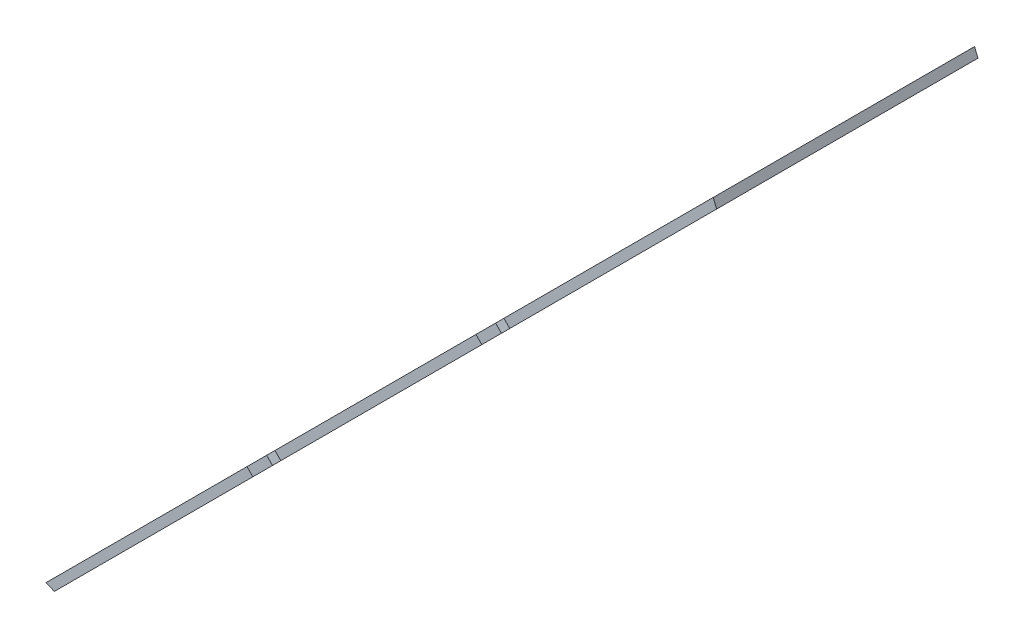
ISO-10303-21;
HEADER;
FILE_DESCRIPTION(('STEP AP214'),'2;1');
FILE_NAME('part.step','',(''),(''),'','','');
FILE_SCHEMA(('AUTOMOTIVE_DESIGN { 1 0 10303 214 1 1 1 1 }'));
ENDSEC;
DATA;
#1=APPLICATION_CONTEXT('core data for automotive mechanical design processes');
#2=APPLICATION_PROTOCOL_DEFINITION('international standard','automotive_design',2000,#1);
#3=PRODUCT_CONTEXT('',#1,'mechanical');
#4=PRODUCT('Part','Part','',(#3));
#5=PRODUCT_RELATED_PRODUCT_CATEGORY('part','',(#4));
#6=PRODUCT_DEFINITION_FORMATION('','',#4);
#7=PRODUCT_DEFINITION_CONTEXT('part definition',#1,'design');
#8=PRODUCT_DEFINITION('design','',#6,#7);
#9=PRODUCT_DEFINITION_SHAPE('','',#8);
#10=(LENGTH_UNIT() NAMED_UNIT(*) SI_UNIT(.MILLI.,.METRE.));
#11=(NAMED_UNIT(*) PLANE_ANGLE_UNIT() SI_UNIT($,.RADIAN.));
#12=(NAMED_UNIT(*) SI_UNIT($,.STERADIAN.) SOLID_ANGLE_UNIT());
#13=UNCERTAINTY_MEASURE_WITH_UNIT(LENGTH_MEASURE(1.E-05),#10,'distance_accuracy_value','');
#14=(GEOMETRIC_REPRESENTATION_CONTEXT(3) GLOBAL_UNCERTAINTY_ASSIGNED_CONTEXT((#13)) GLOBAL_UNIT_ASSIGNED_CONTEXT((#10,
#11,#12)) REPRESENTATION_CONTEXT('',''));
#15=CARTESIAN_POINT('',(0.,0.,0.));
#16=DIRECTION('',(0.,0.,1.));
#17=DIRECTION('',(1.,0.,0.));
#18=AXIS2_PLACEMENT_3D('',#15,#16,#17);
#19=CARTESIAN_POINT('',(265.75,498.5,48.5));
#20=DIRECTION('',(0.,0.,-1.));
#21=DIRECTION('',(-1.,0.,0.));
#22=AXIS2_PLACEMENT_3D('',#19,#20,#21);
#23=PLANE('',#22);
#24=DIRECTION('',(0.707106781186549,0.707106781186546,0.));
#25=VECTOR('',#24,1.);
#26=CARTESIAN_POINT('',(-584.25,380.000000000001,48.5));
#27=LINE('',#26,#25);
#28=CARTESIAN_POINT('',(-543.071488698023,421.178511301978,48.5));
#29=VERTEX_POINT('',#28);
#30=CARTESIAN_POINT('',(-505.428511301978,458.821488698023,48.5));
#31=VERTEX_POINT('',#30);
#32=EDGE_CURVE('E67',#29,#31,#27,.T.);
#33=ORIENTED_EDGE('',*,*,#32,.F.);
#34=DIRECTION('',(-0.707106781186546,0.707106781186549,0.));
#35=VECTOR('',#34,1.);
#36=CARTESIAN_POINT('',(-542.010828526243,420.117851130198,48.5));
#37=LINE('',#36,#35);
#38=CARTESIAN_POINT('',(-542.010828526243,420.117851130198,48.5));
#39=VERTEX_POINT('',#38);
#40=EDGE_CURVE('E187',#39,#29,#37,.T.);
#41=ORIENTED_EDGE('',*,*,#40,.F.);
#42=DIRECTION('',(-0.707106781186549,-0.707106781186546,0.));
#43=VECTOR('',#42,1.);
#44=CARTESIAN_POINT('',(-463.628679656441,498.5,48.5));
#45=LINE('',#44,#43);
#46=CARTESIAN_POINT('',(-504.367851130198,457.760828526243,48.5));
#47=VERTEX_POINT('',#46);
#48=EDGE_CURVE('E45',#47,#39,#45,.T.);
#49=ORIENTED_EDGE('',*,*,#48,.F.);
#50=DIRECTION('',(-0.707106781186546,0.707106781186549,0.));
#51=VECTOR('',#50,1.);
#52=CARTESIAN_POINT('',(-504.367851130198,457.760828526243,48.5));
#53=LINE('',#52,#51);
#54=EDGE_CURVE('E399',#47,#31,#53,.T.);
#55=ORIENTED_EDGE('',*,*,#54,.T.);
#56=EDGE_LOOP('',(#33,#41,#49,#55));
#57=FACE_BOUND('',#56,.T.);
#58=ADVANCED_FACE('F41',(#57),#23,.F.);
#59=DIRECTION('',(-0.707106781186546,0.707106781186549,0.));
#60=VECTOR('',#59,1.);
#61=CARTESIAN_POINT('',(-500.832317224266,461.296362432176,48.5));
#62=LINE('',#61,#60);
#63=CARTESIAN_POINT('',(-500.832317224266,461.296362432176,48.5));
#64=VERTEX_POINT('',#63);
#65=CARTESIAN_POINT('',(-501.892977396045,462.357022603955,48.5));
#66=VERTEX_POINT('',#65);
#67=EDGE_CURVE('E389',#64,#66,#62,.T.);
#68=ORIENTED_EDGE('',*,*,#67,.F.);
#69=CARTESIAN_POINT('',(-463.628679656441,498.5,48.5));
#70=VERTEX_POINT('',#69);
#71=EDGE_CURVE('E51',#70,#64,#45,.T.);
#72=ORIENTED_EDGE('',*,*,#71,.F.);
#73=DIRECTION('',(-0.382683432364995,0.923879532511326,0.));
#74=VECTOR('',#73,1.);
#75=CARTESIAN_POINT('',(-356.813645047253,240.625694781073,48.5));
#76=LINE('',#75,#74);
#77=CARTESIAN_POINT('',(-464.25,500.,48.5));
#78=VERTEX_POINT('',#77);
#79=EDGE_CURVE('E229',#70,#78,#76,.T.);
#80=ORIENTED_EDGE('',*,*,#79,.T.);
#81=EDGE_CURVE('E239',#66,#78,#27,.T.);
#82=ORIENTED_EDGE('',*,*,#81,.F.);
#83=EDGE_LOOP('',(#68,#72,#80,#82));
#84=FACE_BOUND('',#83,.T.);
#85=ADVANCED_FACE('F358',(#84),#23,.F.);
#86=CARTESIAN_POINT('',(265.75,440.,1.5));
#87=DIRECTION('',(0.,0.,1.));
#88=DIRECTION('',(1.,0.,0.));
#89=AXIS2_PLACEMENT_3D('',#86,#87,#88);
#90=PLANE('',#89);
#91=DIRECTION('',(-0.707106781186549,-0.707106781186546,0.));
#92=VECTOR('',#91,1.);
#93=CARTESIAN_POINT('',(-584.25,380.000000000001,1.5));
#94=LINE('',#93,#92);
#95=CARTESIAN_POINT('',(-505.428511301978,458.821488698023,1.5));
#96=VERTEX_POINT('',#95);
#97=CARTESIAN_POINT('',(-543.071488698023,421.178511301978,1.5));
#98=VERTEX_POINT('',#97);
#99=EDGE_CURVE('E254',#96,#98,#94,.T.);
#100=ORIENTED_EDGE('',*,*,#99,.F.);
#101=DIRECTION('',(-0.707106781186546,0.707106781186549,0.));
#102=VECTOR('',#101,1.);
#103=CARTESIAN_POINT('',(-504.367851130198,457.760828526243,1.5));
#104=LINE('',#103,#102);
#105=CARTESIAN_POINT('',(-504.367851130198,457.760828526243,1.5));
#106=VERTEX_POINT('',#105);
#107=EDGE_CURVE('E325',#106,#96,#104,.T.);
#108=ORIENTED_EDGE('',*,*,#107,.F.);
#109=DIRECTION('',(0.707106781186549,0.707106781186546,0.));
#110=VECTOR('',#109,1.);
#111=CARTESIAN_POINT('',(-583.189339828221,378.939339828221,1.49999999999996));
#112=LINE('',#111,#110);
#113=CARTESIAN_POINT('',(-542.010828526243,420.117851130198,1.5));
#114=VERTEX_POINT('',#113);
#115=EDGE_CURVE('E225',#114,#106,#112,.T.);
#116=ORIENTED_EDGE('',*,*,#115,.F.);
#117=DIRECTION('',(-0.707106781186546,0.707106781186549,0.));
#118=VECTOR('',#117,1.);
#119=CARTESIAN_POINT('',(-542.010828526243,420.117851130198,1.5));
#120=LINE('',#119,#118);
#121=EDGE_CURVE('E287',#114,#98,#120,.T.);
#122=ORIENTED_EDGE('',*,*,#121,.T.);
#123=EDGE_LOOP('',(#100,#108,#116,#122));
#124=FACE_BOUND('',#123,.T.);
#125=ADVANCED_FACE('F305',(#124),#90,.F.);
#126=DIRECTION('',(-0.707106781186546,0.707106781186549,0.));
#127=VECTOR('',#126,1.);
#128=CARTESIAN_POINT('',(-545.546362432176,416.582317224266,1.5));
#129=LINE('',#128,#127);
#130=CARTESIAN_POINT('',(-545.546362432176,416.582317224266,1.5));
#131=VERTEX_POINT('',#130);
#132=CARTESIAN_POINT('',(-546.607022603956,417.642977396045,1.5));
#133=VERTEX_POINT('',#132);
#134=EDGE_CURVE('E269',#131,#133,#129,.T.);
#135=ORIENTED_EDGE('',*,*,#134,.F.);
#136=CARTESIAN_POINT('',(-582.75,379.378679656441,1.49999999999997));
#137=VERTEX_POINT('',#136);
#138=EDGE_CURVE('E211',#137,#131,#112,.T.);
#139=ORIENTED_EDGE('',*,*,#138,.F.);
#140=DIRECTION('',(0.923879532511316,-0.382683432365019,0.));
#141=VECTOR('',#140,1.);
#142=CARTESIAN_POINT('',(120.057178568736,88.2664145601641,1.5));
#143=LINE('',#142,#141);
#144=CARTESIAN_POINT('',(-584.25,380.000000000001,1.5));
#145=VERTEX_POINT('',#144);
#146=EDGE_CURVE('E233',#145,#137,#143,.T.);
#147=ORIENTED_EDGE('',*,*,#146,.F.);
#148=EDGE_CURVE('E251',#133,#145,#94,.T.);
#149=ORIENTED_EDGE('',*,*,#148,.F.);
#150=EDGE_LOOP('',(#135,#139,#147,#149));
#151=FACE_BOUND('',#150,.T.);
#152=ADVANCED_FACE('F268',(#151),#90,.F.);
#153=CARTESIAN_POINT('',(-463.628679656441,498.5,50.0101030776414));
#154=DIRECTION('',(-0.923879532511326,-0.382683432364995,0.));
#155=DIRECTION('',(0.382683432364995,-0.923879532511326,0.));
#156=AXIS2_PLACEMENT_3D('',#153,#154,#155);
#157=PLANE('',#156);
#158=DIRECTION('',(0.,0.,1.));
#159=VECTOR('',#158,1.);
#160=CARTESIAN_POINT('',(-464.25,500.,50.));
#161=LINE('',#160,#159);
#162=CARTESIAN_POINT('',(-464.25,500.,1.5));
#163=VERTEX_POINT('',#162);
#164=EDGE_CURVE('E226',#163,#78,#161,.T.);
#165=ORIENTED_EDGE('',*,*,#164,.T.);
#166=ORIENTED_EDGE('',*,*,#79,.F.);
#167=DIRECTION('',(0.,0.,1.));
#168=VECTOR('',#167,1.);
#169=CARTESIAN_POINT('',(-463.628679656441,498.5,50.));
#170=LINE('',#169,#168);
#171=CARTESIAN_POINT('',(-463.628679656441,498.5,1.49999999999996));
#172=VERTEX_POINT('',#171);
#173=EDGE_CURVE('E208',#172,#70,#170,.T.);
#174=ORIENTED_EDGE('',*,*,#173,.F.);
#175=DIRECTION('',(0.382683432364995,-0.923879532511326,0.));
#176=VECTOR('',#175,1.);
#177=CARTESIAN_POINT('',(-336.130771697551,190.692821431363,1.5));
#178=LINE('',#177,#176);
#179=EDGE_CURVE('E235',#163,#172,#178,.T.);
#180=ORIENTED_EDGE('',*,*,#179,.F.);
#181=EDGE_LOOP('',(#165,#166,#174,#180));
#182=FACE_BOUND('',#181,.T.);
#183=ADVANCED_FACE('F368',(#182),#157,.F.);
#184=CARTESIAN_POINT('',(-545.546362432176,416.582317224266,48.5));
#185=VERTEX_POINT('',#184);
#186=CARTESIAN_POINT('',(-582.750000000001,379.378679656441,48.5));
#187=VERTEX_POINT('',#186);
#188=EDGE_CURVE('E205',#185,#187,#45,.T.);
#189=ORIENTED_EDGE('',*,*,#188,.F.);
#190=DIRECTION('',(-0.707106781186546,0.707106781186549,0.));
#191=VECTOR('',#190,1.);
#192=CARTESIAN_POINT('',(-545.546362432176,416.582317224266,48.5));
#193=LINE('',#192,#191);
#194=CARTESIAN_POINT('',(-546.607022603956,417.642977396045,48.5));
#195=VERTEX_POINT('',#194);
#196=EDGE_CURVE('E196',#185,#195,#193,.T.);
#197=ORIENTED_EDGE('',*,*,#196,.T.);
#198=CARTESIAN_POINT('',(-584.25,380.000000000001,48.5));
#199=VERTEX_POINT('',#198);
#200=EDGE_CURVE('E245',#199,#195,#27,.T.);
#201=ORIENTED_EDGE('',*,*,#200,.F.);
#202=DIRECTION('',(-0.923879532511316,0.382683432365019,0.));
#203=VECTOR('',#202,1.);
#204=CARTESIAN_POINT('',(99.3743052190322,96.8335412104544,48.5));
#205=LINE('',#204,#203);
#206=EDGE_CURVE('E11',#187,#199,#205,.T.);
#207=ORIENTED_EDGE('',*,*,#206,.F.);
#208=EDGE_LOOP('',(#189,#197,#201,#207));
#209=FACE_BOUND('',#208,.T.);
#210=ADVANCED_FACE('F360',(#209),#23,.F.);
#211=CARTESIAN_POINT('',(-582.75,379.378679656441,50.0101030776414));
#212=DIRECTION('',(-0.382683432365019,-0.923879532511316,0.));
#213=DIRECTION('',(0.923879532511316,-0.382683432365019,0.));
#214=AXIS2_PLACEMENT_3D('',#211,#212,#213);
#215=PLANE('',#214);
#216=DIRECTION('',(0.,0.,1.));
#217=VECTOR('',#216,1.);
#218=CARTESIAN_POINT('',(-584.25,380.000000000001,50.));
#219=LINE('',#218,#217);
#220=EDGE_CURVE('E215',#145,#199,#219,.T.);
#221=ORIENTED_EDGE('',*,*,#220,.F.);
#222=ORIENTED_EDGE('',*,*,#146,.T.);
#223=DIRECTION('',(0.,0.,1.));
#224=VECTOR('',#223,1.);
#225=CARTESIAN_POINT('',(-582.750000000001,379.378679656441,50.));
#226=LINE('',#225,#224);
#227=EDGE_CURVE('E220',#187,#137,#226,.F.);
#228=ORIENTED_EDGE('',*,*,#227,.F.);
#229=ORIENTED_EDGE('',*,*,#206,.T.);
#230=EDGE_LOOP('',(#221,#222,#228,#229));
#231=FACE_BOUND('',#230,.T.);
#232=ADVANCED_FACE('F263',(#231),#215,.T.);
#233=CARTESIAN_POINT('',(-500.832317224266,461.296362432176,1.49999999999996));
#234=VERTEX_POINT('',#233);
#235=EDGE_CURVE('E222',#234,#172,#112,.T.);
#236=ORIENTED_EDGE('',*,*,#235,.F.);
#237=DIRECTION('',(-0.707106781186546,0.707106781186549,0.));
#238=VECTOR('',#237,1.);
#239=CARTESIAN_POINT('',(-500.832317224266,461.296362432176,1.5));
#240=LINE('',#239,#238);
#241=CARTESIAN_POINT('',(-501.892977396045,462.357022603955,1.5));
#242=VERTEX_POINT('',#241);
#243=EDGE_CURVE('E327',#234,#242,#240,.T.);
#244=ORIENTED_EDGE('',*,*,#243,.T.);
#245=EDGE_CURVE('E255',#163,#242,#94,.T.);
#246=ORIENTED_EDGE('',*,*,#245,.F.);
#247=ORIENTED_EDGE('',*,*,#179,.T.);
#248=EDGE_LOOP('',(#236,#244,#246,#247));
#249=FACE_BOUND('',#248,.T.);
#250=ADVANCED_FACE('F343',(#249),#90,.F.);
#251=CARTESIAN_POINT('',(-584.25,380.000000000001,50.));
#252=DIRECTION('',(0.707106781186546,-0.707106781186549,0.));
#253=DIRECTION('',(0.707106781186549,0.707106781186546,0.));
#254=AXIS2_PLACEMENT_3D('',#251,#252,#253);
#255=PLANE('',#254);
#256=ORIENTED_EDGE('',*,*,#220,.T.);
#257=ORIENTED_EDGE('',*,*,#200,.T.);
#258=DIRECTION('',(0.,0.,1.));
#259=VECTOR('',#258,1.);
#260=CARTESIAN_POINT('',(-546.607022603956,417.642977396045,48.5));
#261=LINE('',#260,#259);
#262=CARTESIAN_POINT('',(-546.607022603956,417.642977396045,50.));
#263=VERTEX_POINT('',#262);
#264=EDGE_CURVE('E616',#195,#263,#261,.T.);
#265=ORIENTED_EDGE('',*,*,#264,.T.);
#266=DIRECTION('',(0.707106781186547,0.707106781186547,0.));
#267=VECTOR('',#266,1.);
#268=CARTESIAN_POINT('',(-543.071488698023,421.178511301978,50.));
#269=LINE('',#268,#267);
#270=CARTESIAN_POINT('',(-543.071488698023,421.178511301978,50.));
#271=VERTEX_POINT('',#270);
#272=EDGE_CURVE('E191',#263,#271,#269,.T.);
#273=ORIENTED_EDGE('',*,*,#272,.T.);
#274=DIRECTION('',(0.,0.,-1.));
#275=VECTOR('',#274,1.);
#276=CARTESIAN_POINT('',(-543.071488698023,421.178511301978,48.5));
#277=LINE('',#276,#275);
#278=EDGE_CURVE('E619',#271,#29,#277,.T.);
#279=ORIENTED_EDGE('',*,*,#278,.T.);
#280=ORIENTED_EDGE('',*,*,#32,.T.);
#281=DIRECTION('',(0.,0.,1.));
#282=VECTOR('',#281,1.);
#283=CARTESIAN_POINT('',(-505.428511301978,458.821488698023,48.5));
#284=LINE('',#283,#282);
#285=CARTESIAN_POINT('',(-505.428511301978,458.821488698023,50.));
#286=VERTEX_POINT('',#285);
#287=EDGE_CURVE('E392',#31,#286,#284,.T.);
#288=ORIENTED_EDGE('',*,*,#287,.T.);
#289=DIRECTION('',(0.707106781186547,0.707106781186547,0.));
#290=VECTOR('',#289,1.);
#291=CARTESIAN_POINT('',(-501.892977396045,462.357022603955,50.));
#292=LINE('',#291,#290);
#293=CARTESIAN_POINT('',(-501.892977396045,462.357022603955,50.));
#294=VERTEX_POINT('',#293);
#295=EDGE_CURVE('E384',#286,#294,#292,.T.);
#296=ORIENTED_EDGE('',*,*,#295,.T.);
#297=DIRECTION('',(0.,0.,-1.));
#298=VECTOR('',#297,1.);
#299=CARTESIAN_POINT('',(-501.892977396045,462.357022603955,48.5));
#300=LINE('',#299,#298);
#301=EDGE_CURVE('E390',#294,#66,#300,.T.);
#302=ORIENTED_EDGE('',*,*,#301,.T.);
#303=ORIENTED_EDGE('',*,*,#81,.T.);
#304=ORIENTED_EDGE('',*,*,#164,.F.);
#305=ORIENTED_EDGE('',*,*,#245,.T.);
#306=DIRECTION('',(0.,0.,-1.));
#307=VECTOR('',#306,1.);
#308=CARTESIAN_POINT('',(-501.892977396045,462.357022603955,1.5));
#309=LINE('',#308,#307);
#310=CARTESIAN_POINT('',(-501.892977396045,462.357022603955,0.));
#311=VERTEX_POINT('',#310);
#312=EDGE_CURVE('E334',#242,#311,#309,.T.);
#313=ORIENTED_EDGE('',*,*,#312,.T.);
#314=DIRECTION('',(-0.707106781186547,-0.707106781186547,0.));
#315=VECTOR('',#314,1.);
#316=CARTESIAN_POINT('',(-505.428511301978,458.821488698023,0.));
#317=LINE('',#316,#315);
#318=CARTESIAN_POINT('',(-505.428511301978,458.821488698023,0.));
#319=VERTEX_POINT('',#318);
#320=EDGE_CURVE('E317',#311,#319,#317,.T.);
#321=ORIENTED_EDGE('',*,*,#320,.T.);
#322=DIRECTION('',(0.,0.,1.));
#323=VECTOR('',#322,1.);
#324=CARTESIAN_POINT('',(-505.428511301978,458.821488698023,1.5));
#325=LINE('',#324,#323);
#326=EDGE_CURVE('E331',#319,#96,#325,.T.);
#327=ORIENTED_EDGE('',*,*,#326,.T.);
#328=ORIENTED_EDGE('',*,*,#99,.T.);
#329=DIRECTION('',(0.,0.,-1.));
#330=VECTOR('',#329,1.);
#331=CARTESIAN_POINT('',(-543.071488698023,421.178511301978,1.5));
#332=LINE('',#331,#330);
#333=CARTESIAN_POINT('',(-543.071488698023,421.178511301978,0.));
#334=VERTEX_POINT('',#333);
#335=EDGE_CURVE('E293',#98,#334,#332,.T.);
#336=ORIENTED_EDGE('',*,*,#335,.T.);
#337=DIRECTION('',(-0.707106781186547,-0.707106781186547,0.));
#338=VECTOR('',#337,1.);
#339=CARTESIAN_POINT('',(-546.607022603956,417.642977396045,0.));
#340=LINE('',#339,#338);
#341=CARTESIAN_POINT('',(-546.607022603956,417.642977396045,0.));
#342=VERTEX_POINT('',#341);
#343=EDGE_CURVE('E278',#334,#342,#340,.T.);
#344=ORIENTED_EDGE('',*,*,#343,.T.);
#345=DIRECTION('',(0.,0.,1.));
#346=VECTOR('',#345,1.);
#347=CARTESIAN_POINT('',(-546.607022603956,417.642977396045,1.5));
#348=LINE('',#347,#346);
#349=EDGE_CURVE('E291',#342,#133,#348,.T.);
#350=ORIENTED_EDGE('',*,*,#349,.T.);
#351=ORIENTED_EDGE('',*,*,#148,.T.);
#352=EDGE_LOOP('',(#256,#257,#265,#273,#279,#280,#288,#296,#302,#303,#304,#305,#313,#321,#327,
#328,#336,#344,#350,#351));
#353=FACE_BOUND('',#352,.T.);
#354=ADVANCED_FACE('F43',(#353),#255,.F.);
#355=CARTESIAN_POINT('',(-583.189339828221,378.939339828221,50.));
#356=DIRECTION('',(0.707106781186546,-0.707106781186549,0.));
#357=DIRECTION('',(0.707106781186549,0.707106781186546,0.));
#358=AXIS2_PLACEMENT_3D('',#355,#356,#357);
#359=PLANE('',#358);
#360=ORIENTED_EDGE('',*,*,#138,.T.);
#361=DIRECTION('',(0.,0.,1.));
#362=VECTOR('',#361,1.);
#363=CARTESIAN_POINT('',(-545.546362432176,416.582317224266,1.5));
#364=LINE('',#363,#362);
#365=CARTESIAN_POINT('',(-545.546362432176,416.582317224266,0.));
#366=VERTEX_POINT('',#365);
#367=EDGE_CURVE('E272',#366,#131,#364,.T.);
#368=ORIENTED_EDGE('',*,*,#367,.F.);
#369=DIRECTION('',(-0.707106781186547,-0.707106781186547,0.));
#370=VECTOR('',#369,1.);
#371=CARTESIAN_POINT('',(-545.546362432176,416.582317224266,0.));
#372=LINE('',#371,#370);
#373=CARTESIAN_POINT('',(-542.010828526243,420.117851130198,0.));
#374=VERTEX_POINT('',#373);
#375=EDGE_CURVE('E275',#374,#366,#372,.T.);
#376=ORIENTED_EDGE('',*,*,#375,.F.);
#377=DIRECTION('',(0.,0.,-1.));
#378=VECTOR('',#377,1.);
#379=CARTESIAN_POINT('',(-542.010828526243,420.117851130198,1.5));
#380=LINE('',#379,#378);
#381=EDGE_CURVE('E277',#114,#374,#380,.T.);
#382=ORIENTED_EDGE('',*,*,#381,.F.);
#383=ORIENTED_EDGE('',*,*,#115,.T.);
#384=DIRECTION('',(0.,0.,1.));
#385=VECTOR('',#384,1.);
#386=CARTESIAN_POINT('',(-504.367851130198,457.760828526243,1.5));
#387=LINE('',#386,#385);
#388=CARTESIAN_POINT('',(-504.367851130198,457.760828526243,0.));
#389=VERTEX_POINT('',#388);
#390=EDGE_CURVE('E312',#389,#106,#387,.T.);
#391=ORIENTED_EDGE('',*,*,#390,.F.);
#392=DIRECTION('',(-0.707106781186547,-0.707106781186547,0.));
#393=VECTOR('',#392,1.);
#394=CARTESIAN_POINT('',(-504.367851130198,457.760828526243,0.));
#395=LINE('',#394,#393);
#396=CARTESIAN_POINT('',(-500.832317224266,461.296362432176,0.));
#397=VERTEX_POINT('',#396);
#398=EDGE_CURVE('E314',#397,#389,#395,.T.);
#399=ORIENTED_EDGE('',*,*,#398,.F.);
#400=DIRECTION('',(0.,0.,-1.));
#401=VECTOR('',#400,1.);
#402=CARTESIAN_POINT('',(-500.832317224266,461.296362432176,1.5));
#403=LINE('',#402,#401);
#404=EDGE_CURVE('E316',#234,#397,#403,.T.);
#405=ORIENTED_EDGE('',*,*,#404,.F.);
#406=ORIENTED_EDGE('',*,*,#235,.T.);
#407=ORIENTED_EDGE('',*,*,#173,.T.);
#408=ORIENTED_EDGE('',*,*,#71,.T.);
#409=DIRECTION('',(0.,0.,-1.));
#410=VECTOR('',#409,1.);
#411=CARTESIAN_POINT('',(-500.832317224266,461.296362432176,48.5));
#412=LINE('',#411,#410);
#413=CARTESIAN_POINT('',(-500.832317224266,461.296362432176,50.));
#414=VERTEX_POINT('',#413);
#415=EDGE_CURVE('E382',#414,#64,#412,.T.);
#416=ORIENTED_EDGE('',*,*,#415,.F.);
#417=DIRECTION('',(0.707106781186547,0.707106781186547,0.));
#418=VECTOR('',#417,1.);
#419=CARTESIAN_POINT('',(-500.832317224266,461.296362432176,50.));
#420=LINE('',#419,#418);
#421=CARTESIAN_POINT('',(-504.367851130198,457.760828526243,50.));
#422=VERTEX_POINT('',#421);
#423=EDGE_CURVE('E386',#422,#414,#420,.T.);
#424=ORIENTED_EDGE('',*,*,#423,.F.);
#425=DIRECTION('',(0.,0.,1.));
#426=VECTOR('',#425,1.);
#427=CARTESIAN_POINT('',(-504.367851130198,457.760828526243,48.5));
#428=LINE('',#427,#426);
#429=EDGE_CURVE('E204',#47,#422,#428,.T.);
#430=ORIENTED_EDGE('',*,*,#429,.F.);
#431=ORIENTED_EDGE('',*,*,#48,.T.);
#432=DIRECTION('',(0.,0.,-1.));
#433=VECTOR('',#432,1.);
#434=CARTESIAN_POINT('',(-542.010828526243,420.117851130198,48.5));
#435=LINE('',#434,#433);
#436=CARTESIAN_POINT('',(-542.010828526243,420.117851130198,50.));
#437=VERTEX_POINT('',#436);
#438=EDGE_CURVE('E183',#437,#39,#435,.T.);
#439=ORIENTED_EDGE('',*,*,#438,.F.);
#440=DIRECTION('',(0.707106781186547,0.707106781186547,0.));
#441=VECTOR('',#440,1.);
#442=CARTESIAN_POINT('',(-542.010828526243,420.117851130198,50.));
#443=LINE('',#442,#441);
#444=CARTESIAN_POINT('',(-545.546362432176,416.582317224266,50.));
#445=VERTEX_POINT('',#444);
#446=EDGE_CURVE('E197',#445,#437,#443,.T.);
#447=ORIENTED_EDGE('',*,*,#446,.F.);
#448=DIRECTION('',(0.,0.,1.));
#449=VECTOR('',#448,1.);
#450=CARTESIAN_POINT('',(-545.546362432176,416.582317224266,48.5));
#451=LINE('',#450,#449);
#452=EDGE_CURVE('E59',#185,#445,#451,.T.);
#453=ORIENTED_EDGE('',*,*,#452,.F.);
#454=ORIENTED_EDGE('',*,*,#188,.T.);
#455=ORIENTED_EDGE('',*,*,#227,.T.);
#456=EDGE_LOOP('',(#360,#368,#376,#382,#383,#391,#399,#405,#406,#407,#408,#416,#424,#430,#431,
#439,#447,#453,#454,#455));
#457=FACE_BOUND('',#456,.T.);
#458=ADVANCED_FACE('F201',(#457),#359,.T.);
#459=CARTESIAN_POINT('',(-545.546362432176,416.582317224266,1.5));
#460=DIRECTION('',(-0.707106781186548,-0.707106781186546,0.));
#461=DIRECTION('',(0.707106781186546,-0.707106781186549,0.));
#462=AXIS2_PLACEMENT_3D('',#459,#460,#461);
#463=PLANE('',#462);
#464=ORIENTED_EDGE('',*,*,#349,.F.);
#465=DIRECTION('',(-0.707106781186546,0.707106781186549,0.));
#466=VECTOR('',#465,1.);
#467=CARTESIAN_POINT('',(-545.546362432176,416.582317224266,0.));
#468=LINE('',#467,#466);
#469=EDGE_CURVE('E232',#366,#342,#468,.T.);
#470=ORIENTED_EDGE('',*,*,#469,.F.);
#471=ORIENTED_EDGE('',*,*,#367,.T.);
#472=ORIENTED_EDGE('',*,*,#134,.T.);
#473=EDGE_LOOP('',(#464,#470,#471,#472));
#474=FACE_BOUND('',#473,.T.);
#475=ADVANCED_FACE('F489',(#474),#463,.T.);
#476=CARTESIAN_POINT('',(-545.546362432176,416.582317224266,0.));
#477=DIRECTION('',(0.,0.,-1.));
#478=DIRECTION('',(-1.,0.,0.));
#479=AXIS2_PLACEMENT_3D('',#476,#477,#478);
#480=PLANE('',#479);
#481=ORIENTED_EDGE('',*,*,#343,.F.);
#482=DIRECTION('',(-0.707106781186546,0.707106781186549,0.));
#483=VECTOR('',#482,1.);
#484=CARTESIAN_POINT('',(-542.010828526243,420.117851130198,0.));
#485=LINE('',#484,#483);
#486=EDGE_CURVE('E284',#374,#334,#485,.T.);
#487=ORIENTED_EDGE('',*,*,#486,.F.);
#488=ORIENTED_EDGE('',*,*,#375,.T.);
#489=ORIENTED_EDGE('',*,*,#469,.T.);
#490=EDGE_LOOP('',(#481,#487,#488,#489));
#491=FACE_BOUND('',#490,.T.);
#492=ADVANCED_FACE('F282',(#491),#480,.T.);
#493=CARTESIAN_POINT('',(-542.010828526243,420.117851130198,1.5));
#494=DIRECTION('',(0.707106781186548,0.707106781186546,0.));
#495=DIRECTION('',(-0.707106781186546,0.707106781186549,0.));
#496=AXIS2_PLACEMENT_3D('',#493,#494,#495);
#497=PLANE('',#496);
#498=ORIENTED_EDGE('',*,*,#335,.F.);
#499=ORIENTED_EDGE('',*,*,#121,.F.);
#500=ORIENTED_EDGE('',*,*,#381,.T.);
#501=ORIENTED_EDGE('',*,*,#486,.T.);
#502=EDGE_LOOP('',(#498,#499,#500,#501));
#503=FACE_BOUND('',#502,.T.);
#504=ADVANCED_FACE('F309',(#503),#497,.T.);
#505=CARTESIAN_POINT('',(-504.367851130198,457.760828526243,1.5));
#506=DIRECTION('',(-0.707106781186548,-0.707106781186546,0.));
#507=DIRECTION('',(0.707106781186546,-0.707106781186549,0.));
#508=AXIS2_PLACEMENT_3D('',#505,#506,#507);
#509=PLANE('',#508);
#510=ORIENTED_EDGE('',*,*,#326,.F.);
#511=DIRECTION('',(-0.707106781186546,0.707106781186549,0.));
#512=VECTOR('',#511,1.);
#513=CARTESIAN_POINT('',(-504.367851130198,457.760828526243,0.));
#514=LINE('',#513,#512);
#515=EDGE_CURVE('E294',#389,#319,#514,.T.);
#516=ORIENTED_EDGE('',*,*,#515,.F.);
#517=ORIENTED_EDGE('',*,*,#390,.T.);
#518=ORIENTED_EDGE('',*,*,#107,.T.);
#519=EDGE_LOOP('',(#510,#516,#517,#518));
#520=FACE_BOUND('',#519,.T.);
#521=ADVANCED_FACE('F346',(#520),#509,.T.);
#522=CARTESIAN_POINT('',(-504.367851130198,457.760828526243,0.));
#523=DIRECTION('',(0.,0.,-1.));
#524=DIRECTION('',(-1.,0.,0.));
#525=AXIS2_PLACEMENT_3D('',#522,#523,#524);
#526=PLANE('',#525);
#527=ORIENTED_EDGE('',*,*,#320,.F.);
#528=DIRECTION('',(-0.707106781186546,0.707106781186549,0.));
#529=VECTOR('',#528,1.);
#530=CARTESIAN_POINT('',(-500.832317224266,461.296362432176,0.));
#531=LINE('',#530,#529);
#532=EDGE_CURVE('E323',#397,#311,#531,.T.);
#533=ORIENTED_EDGE('',*,*,#532,.F.);
#534=ORIENTED_EDGE('',*,*,#398,.T.);
#535=ORIENTED_EDGE('',*,*,#515,.T.);
#536=EDGE_LOOP('',(#527,#533,#534,#535));
#537=FACE_BOUND('',#536,.T.);
#538=ADVANCED_FACE('F321',(#537),#526,.T.);
#539=CARTESIAN_POINT('',(-500.832317224266,461.296362432176,1.5));
#540=DIRECTION('',(0.707106781186548,0.707106781186546,0.));
#541=DIRECTION('',(-0.707106781186546,0.707106781186549,0.));
#542=AXIS2_PLACEMENT_3D('',#539,#540,#541);
#543=PLANE('',#542);
#544=ORIENTED_EDGE('',*,*,#312,.F.);
#545=ORIENTED_EDGE('',*,*,#243,.F.);
#546=ORIENTED_EDGE('',*,*,#404,.T.);
#547=ORIENTED_EDGE('',*,*,#532,.T.);
#548=EDGE_LOOP('',(#544,#545,#546,#547));
#549=FACE_BOUND('',#548,.T.);
#550=ADVANCED_FACE('F345',(#549),#543,.T.);
#551=CARTESIAN_POINT('',(-500.832317224266,461.296362432176,48.5));
#552=DIRECTION('',(0.707106781186548,0.707106781186546,0.));
#553=DIRECTION('',(-0.707106781186546,0.707106781186549,0.));
#554=AXIS2_PLACEMENT_3D('',#551,#552,#553);
#555=PLANE('',#554);
#556=ORIENTED_EDGE('',*,*,#301,.F.);
#557=DIRECTION('',(-0.707106781186546,0.707106781186549,0.));
#558=VECTOR('',#557,1.);
#559=CARTESIAN_POINT('',(-500.832317224266,461.296362432176,50.));
#560=LINE('',#559,#558);
#561=EDGE_CURVE('E335',#414,#294,#560,.T.);
#562=ORIENTED_EDGE('',*,*,#561,.F.);
#563=ORIENTED_EDGE('',*,*,#415,.T.);
#564=ORIENTED_EDGE('',*,*,#67,.T.);
#565=EDGE_LOOP('',(#556,#562,#563,#564));
#566=FACE_BOUND('',#565,.T.);
#567=ADVANCED_FACE('F404',(#566),#555,.T.);
#568=CARTESIAN_POINT('',(-500.832317224266,461.296362432176,50.));
#569=DIRECTION('',(0.,0.,1.));
#570=DIRECTION('',(1.,0.,0.));
#571=AXIS2_PLACEMENT_3D('',#568,#569,#570);
#572=PLANE('',#571);
#573=ORIENTED_EDGE('',*,*,#295,.F.);
#574=DIRECTION('',(-0.707106781186546,0.707106781186549,0.));
#575=VECTOR('',#574,1.);
#576=CARTESIAN_POINT('',(-504.367851130198,457.760828526243,50.));
#577=LINE('',#576,#575);
#578=EDGE_CURVE('E397',#422,#286,#577,.T.);
#579=ORIENTED_EDGE('',*,*,#578,.F.);
#580=ORIENTED_EDGE('',*,*,#423,.T.);
#581=ORIENTED_EDGE('',*,*,#561,.T.);
#582=EDGE_LOOP('',(#573,#579,#580,#581));
#583=FACE_BOUND('',#582,.T.);
#584=ADVANCED_FACE('F410',(#583),#572,.T.);
#585=CARTESIAN_POINT('',(-504.367851130198,457.760828526243,48.5));
#586=DIRECTION('',(-0.707106781186548,-0.707106781186546,0.));
#587=DIRECTION('',(0.707106781186546,-0.707106781186549,0.));
#588=AXIS2_PLACEMENT_3D('',#585,#586,#587);
#589=PLANE('',#588);
#590=ORIENTED_EDGE('',*,*,#287,.F.);
#591=ORIENTED_EDGE('',*,*,#54,.F.);
#592=ORIENTED_EDGE('',*,*,#429,.T.);
#593=ORIENTED_EDGE('',*,*,#578,.T.);
#594=EDGE_LOOP('',(#590,#591,#592,#593));
#595=FACE_BOUND('',#594,.T.);
#596=ADVANCED_FACE('F412',(#595),#589,.T.);
#597=CARTESIAN_POINT('',(-542.010828526243,420.117851130198,48.5));
#598=DIRECTION('',(0.707106781186548,0.707106781186546,0.));
#599=DIRECTION('',(-0.707106781186546,0.707106781186549,0.));
#600=AXIS2_PLACEMENT_3D('',#597,#598,#599);
#601=PLANE('',#600);
#602=ORIENTED_EDGE('',*,*,#278,.F.);
#603=DIRECTION('',(-0.707106781186546,0.707106781186549,0.));
#604=VECTOR('',#603,1.);
#605=CARTESIAN_POINT('',(-542.010828526243,420.117851130198,50.));
#606=LINE('',#605,#604);
#607=EDGE_CURVE('E188',#437,#271,#606,.T.);
#608=ORIENTED_EDGE('',*,*,#607,.F.);
#609=ORIENTED_EDGE('',*,*,#438,.T.);
#610=ORIENTED_EDGE('',*,*,#40,.T.);
#611=EDGE_LOOP('',(#602,#608,#609,#610));
#612=FACE_BOUND('',#611,.T.);
#613=ADVANCED_FACE('F186',(#612),#601,.T.);
#614=CARTESIAN_POINT('',(-542.010828526243,420.117851130198,50.));
#615=DIRECTION('',(0.,0.,1.));
#616=DIRECTION('',(1.,0.,0.));
#617=AXIS2_PLACEMENT_3D('',#614,#615,#616);
#618=PLANE('',#617);
#619=ORIENTED_EDGE('',*,*,#272,.F.);
#620=DIRECTION('',(-0.707106781186546,0.707106781186549,0.));
#621=VECTOR('',#620,1.);
#622=CARTESIAN_POINT('',(-545.546362432176,416.582317224266,50.));
#623=LINE('',#622,#621);
#624=EDGE_CURVE('E377',#445,#263,#623,.T.);
#625=ORIENTED_EDGE('',*,*,#624,.F.);
#626=ORIENTED_EDGE('',*,*,#446,.T.);
#627=ORIENTED_EDGE('',*,*,#607,.T.);
#628=EDGE_LOOP('',(#619,#625,#626,#627));
#629=FACE_BOUND('',#628,.T.);
#630=ADVANCED_FACE('F419',(#629),#618,.T.);
#631=CARTESIAN_POINT('',(-545.546362432176,416.582317224266,48.5));
#632=DIRECTION('',(-0.707106781186548,-0.707106781186546,0.));
#633=DIRECTION('',(0.707106781186546,-0.707106781186549,0.));
#634=AXIS2_PLACEMENT_3D('',#631,#632,#633);
#635=PLANE('',#634);
#636=ORIENTED_EDGE('',*,*,#264,.F.);
#637=ORIENTED_EDGE('',*,*,#196,.F.);
#638=ORIENTED_EDGE('',*,*,#452,.T.);
#639=ORIENTED_EDGE('',*,*,#624,.T.);
#640=EDGE_LOOP('',(#636,#637,#638,#639));
#641=FACE_BOUND('',#640,.T.);
#642=ADVANCED_FACE('F457',(#641),#635,.T.);
#643=CLOSED_SHELL('',(#58,#85,#125,#152,#183,#210,#232,#250,#354,#458,#475,#492,#504,#521,#538,
#550,#567,#584,#596,#613,#630,#642));
#644=MANIFOLD_SOLID_BREP('B2',#643);
#645=ADVANCED_BREP_SHAPE_REPRESENTATION('',(#18,#644),#14);
#646=SHAPE_DEFINITION_REPRESENTATION(#9,#645);
ENDSEC;
END-ISO-10303-21;
